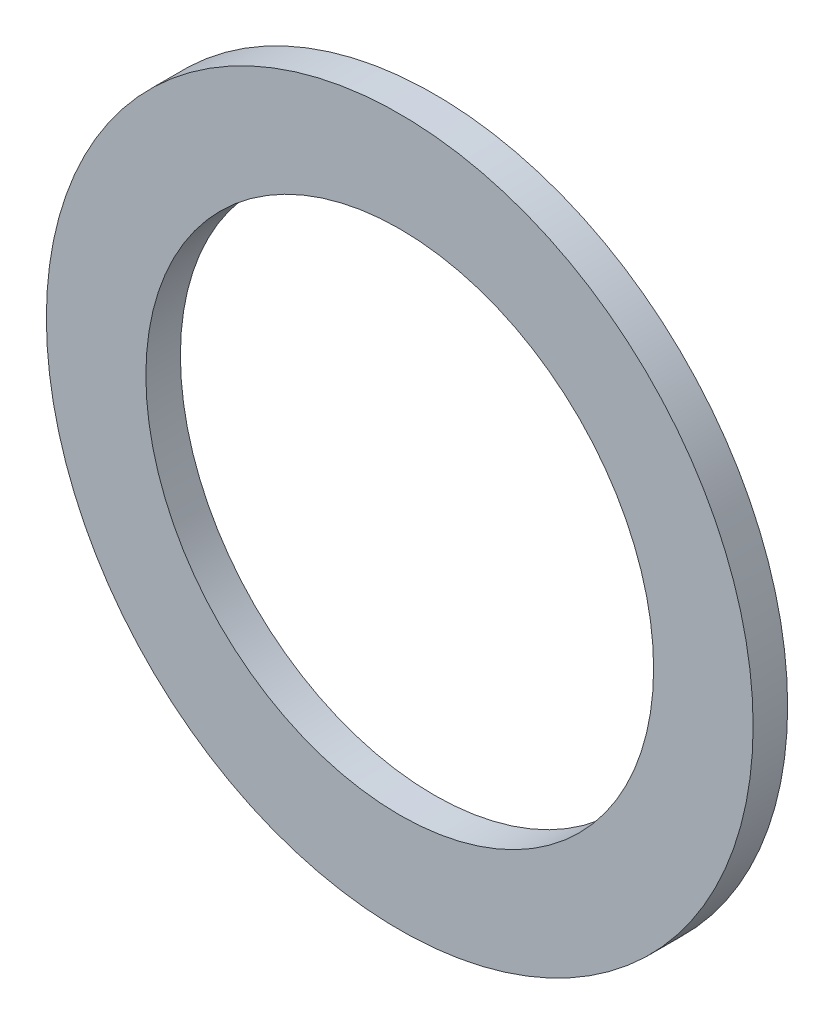
ISO-10303-21;
HEADER;
FILE_DESCRIPTION(('STEP AP214'),'2;1');
FILE_NAME('part.step','',(''),(''),'','','');
FILE_SCHEMA(('AUTOMOTIVE_DESIGN { 1 0 10303 214 1 1 1 1 }'));
ENDSEC;
DATA;
#1=APPLICATION_CONTEXT('core data for automotive mechanical design processes');
#2=APPLICATION_PROTOCOL_DEFINITION('international standard','automotive_design',2000,#1);
#3=PRODUCT_CONTEXT('',#1,'mechanical');
#4=PRODUCT('Part','Part','',(#3));
#5=PRODUCT_RELATED_PRODUCT_CATEGORY('part','',(#4));
#6=PRODUCT_DEFINITION_FORMATION('','',#4);
#7=PRODUCT_DEFINITION_CONTEXT('part definition',#1,'design');
#8=PRODUCT_DEFINITION('design','',#6,#7);
#9=PRODUCT_DEFINITION_SHAPE('','',#8);
#10=(LENGTH_UNIT() NAMED_UNIT(*) SI_UNIT(.MILLI.,.METRE.));
#11=(NAMED_UNIT(*) PLANE_ANGLE_UNIT() SI_UNIT($,.RADIAN.));
#12=(NAMED_UNIT(*) SI_UNIT($,.STERADIAN.) SOLID_ANGLE_UNIT());
#13=UNCERTAINTY_MEASURE_WITH_UNIT(LENGTH_MEASURE(1.E-05),#10,'distance_accuracy_value','');
#14=(GEOMETRIC_REPRESENTATION_CONTEXT(3) GLOBAL_UNCERTAINTY_ASSIGNED_CONTEXT((#13)) GLOBAL_UNIT_ASSIGNED_CONTEXT((#10,
#11,#12)) REPRESENTATION_CONTEXT('',''));
#15=CARTESIAN_POINT('',(0.,0.,0.));
#16=DIRECTION('',(0.,0.,1.));
#17=DIRECTION('',(1.,0.,0.));
#18=AXIS2_PLACEMENT_3D('',#15,#16,#17);
#19=CARTESIAN_POINT('',(0.,0.,1.7));
#20=DIRECTION('',(0.,0.,1.));
#21=DIRECTION('',(1.,0.,0.));
#22=AXIS2_PLACEMENT_3D('',#19,#20,#21);
#23=PLANE('',#22);
#24=CARTESIAN_POINT('',(0.,0.,1.7));
#25=DIRECTION('',(0.,0.,1.));
#26=DIRECTION('',(1.,0.,0.));
#27=AXIS2_PLACEMENT_3D('',#24,#25,#26);
#28=CIRCLE('',#27,17.4);
#29=CARTESIAN_POINT('',(17.4,0.,1.7));
#30=VERTEX_POINT('',#29);
#31=EDGE_CURVE('E10',#30,#30,#28,.T.);
#32=ORIENTED_EDGE('',*,*,#31,.T.);
#33=EDGE_LOOP('',(#32));
#34=FACE_BOUND('',#33,.T.);
#35=CARTESIAN_POINT('',(0.,0.,1.7));
#36=DIRECTION('',(0.,0.,1.));
#37=DIRECTION('',(1.,0.,0.));
#38=AXIS2_PLACEMENT_3D('',#35,#36,#37);
#39=CIRCLE('',#38,12.5);
#40=CARTESIAN_POINT('',(12.5,0.,1.7));
#41=VERTEX_POINT('',#40);
#42=EDGE_CURVE('E42',#41,#41,#39,.T.);
#43=ORIENTED_EDGE('',*,*,#42,.F.);
#44=EDGE_LOOP('',(#43));
#45=FACE_BOUND('',#44,.T.);
#46=ADVANCED_FACE('F31',(#34,#45),#23,.T.);
#47=CARTESIAN_POINT('',(0.,0.,0.));
#48=DIRECTION('',(0.,0.,1.));
#49=DIRECTION('',(1.,0.,0.));
#50=AXIS2_PLACEMENT_3D('',#47,#48,#49);
#51=PLANE('',#50);
#52=CARTESIAN_POINT('',(0.,0.,0.));
#53=DIRECTION('',(0.,0.,1.));
#54=DIRECTION('',(1.,0.,0.));
#55=AXIS2_PLACEMENT_3D('',#52,#53,#54);
#56=CIRCLE('',#55,17.4);
#57=CARTESIAN_POINT('',(17.4,0.,0.));
#58=VERTEX_POINT('',#57);
#59=EDGE_CURVE('E38',#58,#58,#56,.T.);
#60=ORIENTED_EDGE('',*,*,#59,.F.);
#61=EDGE_LOOP('',(#60));
#62=FACE_BOUND('',#61,.T.);
#63=CARTESIAN_POINT('',(0.,0.,0.));
#64=DIRECTION('',(0.,0.,1.));
#65=DIRECTION('',(1.,0.,0.));
#66=AXIS2_PLACEMENT_3D('',#63,#64,#65);
#67=CIRCLE('',#66,12.5);
#68=CARTESIAN_POINT('',(12.5,0.,0.));
#69=VERTEX_POINT('',#68);
#70=EDGE_CURVE('E46',#69,#69,#67,.T.);
#71=ORIENTED_EDGE('',*,*,#70,.T.);
#72=EDGE_LOOP('',(#71));
#73=FACE_BOUND('',#72,.T.);
#74=ADVANCED_FACE('F52',(#62,#73),#51,.F.);
#75=CARTESIAN_POINT('',(0.,0.,1.7));
#76=DIRECTION('',(0.,0.,-1.));
#77=DIRECTION('',(-1.,0.,0.));
#78=AXIS2_PLACEMENT_3D('',#75,#76,#77);
#79=CYLINDRICAL_SURFACE('',#78,17.4);
#80=ORIENTED_EDGE('',*,*,#31,.F.);
#81=EDGE_LOOP('',(#80));
#82=FACE_BOUND('',#81,.T.);
#83=ORIENTED_EDGE('',*,*,#59,.T.);
#84=EDGE_LOOP('',(#83));
#85=FACE_BOUND('',#84,.T.);
#86=ADVANCED_FACE('F33',(#82,#85),#79,.T.);
#87=CARTESIAN_POINT('',(0.,0.,1.7));
#88=DIRECTION('',(0.,0.,-1.));
#89=DIRECTION('',(-1.,0.,0.));
#90=AXIS2_PLACEMENT_3D('',#87,#88,#89);
#91=CYLINDRICAL_SURFACE('',#90,12.5);
#92=ORIENTED_EDGE('',*,*,#42,.T.);
#93=EDGE_LOOP('',(#92));
#94=FACE_BOUND('',#93,.T.);
#95=ORIENTED_EDGE('',*,*,#70,.F.);
#96=EDGE_LOOP('',(#95));
#97=FACE_BOUND('',#96,.T.);
#98=ADVANCED_FACE('F54',(#94,#97),#91,.F.);
#99=CLOSED_SHELL('',(#46,#74,#86,#98));
#100=MANIFOLD_SOLID_BREP('B2',#99);
#101=ADVANCED_BREP_SHAPE_REPRESENTATION('',(#18,#100),#14);
#102=SHAPE_DEFINITION_REPRESENTATION(#9,#101);
ENDSEC;
END-ISO-10303-21;
